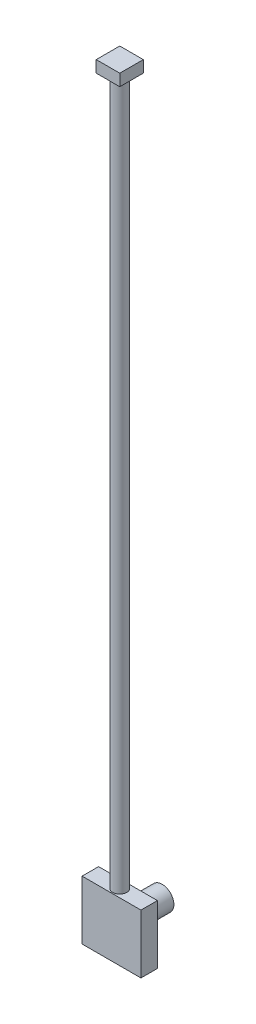
ISO-10303-21;
HEADER;
FILE_DESCRIPTION(('STEP AP214'),'2;1');
FILE_NAME('part.step','',(''),(''),'','','');
FILE_SCHEMA(('AUTOMOTIVE_DESIGN { 1 0 10303 214 1 1 1 1 }'));
ENDSEC;
DATA;
#1=APPLICATION_CONTEXT('core data for automotive mechanical design processes');
#2=APPLICATION_PROTOCOL_DEFINITION('international standard','automotive_design',2000,#1);
#3=PRODUCT_CONTEXT('',#1,'mechanical');
#4=PRODUCT('Part','Part','',(#3));
#5=PRODUCT_RELATED_PRODUCT_CATEGORY('part','',(#4));
#6=PRODUCT_DEFINITION_FORMATION('','',#4);
#7=PRODUCT_DEFINITION_CONTEXT('part definition',#1,'design');
#8=PRODUCT_DEFINITION('design','',#6,#7);
#9=PRODUCT_DEFINITION_SHAPE('','',#8);
#10=(LENGTH_UNIT() NAMED_UNIT(*) SI_UNIT(.MILLI.,.METRE.));
#11=(NAMED_UNIT(*) PLANE_ANGLE_UNIT() SI_UNIT($,.RADIAN.));
#12=(NAMED_UNIT(*) SI_UNIT($,.STERADIAN.) SOLID_ANGLE_UNIT());
#13=UNCERTAINTY_MEASURE_WITH_UNIT(LENGTH_MEASURE(1.E-05),#10,'distance_accuracy_value','');
#14=(GEOMETRIC_REPRESENTATION_CONTEXT(3) GLOBAL_UNCERTAINTY_ASSIGNED_CONTEXT((#13)) GLOBAL_UNIT_ASSIGNED_CONTEXT((#10,
#11,#12)) REPRESENTATION_CONTEXT('',''));
#15=CARTESIAN_POINT('',(0.,0.,0.));
#16=DIRECTION('',(0.,0.,1.));
#17=DIRECTION('',(1.,0.,0.));
#18=AXIS2_PLACEMENT_3D('',#15,#16,#17);
#19=CARTESIAN_POINT('',(125.,-125.,35.));
#20=DIRECTION('',(-1.,0.,0.));
#21=DIRECTION('',(0.,0.,1.));
#22=AXIS2_PLACEMENT_3D('',#19,#20,#21);
#23=PLANE('',#22);
#24=DIRECTION('',(0.,1.,0.));
#25=VECTOR('',#24,1.);
#26=CARTESIAN_POINT('',(125.,-125.,-35.));
#27=LINE('',#26,#25);
#28=CARTESIAN_POINT('',(125.,-125.,-35.));
#29=VERTEX_POINT('',#28);
#30=CARTESIAN_POINT('',(125.,125.,-35.));
#31=VERTEX_POINT('',#30);
#32=EDGE_CURVE('E146',#29,#31,#27,.T.);
#33=ORIENTED_EDGE('',*,*,#32,.T.);
#34=DIRECTION('',(0.,0.,-1.));
#35=VECTOR('',#34,1.);
#36=CARTESIAN_POINT('',(125.,125.,35.));
#37=LINE('',#36,#35);
#38=CARTESIAN_POINT('',(125.,125.,35.));
#39=VERTEX_POINT('',#38);
#40=EDGE_CURVE('E11',#39,#31,#37,.T.);
#41=ORIENTED_EDGE('',*,*,#40,.F.);
#42=DIRECTION('',(0.,1.,0.));
#43=VECTOR('',#42,1.);
#44=CARTESIAN_POINT('',(125.,-125.,35.));
#45=LINE('',#44,#43);
#46=CARTESIAN_POINT('',(125.,-125.,35.));
#47=VERTEX_POINT('',#46);
#48=EDGE_CURVE('E147',#47,#39,#45,.T.);
#49=ORIENTED_EDGE('',*,*,#48,.F.);
#50=DIRECTION('',(0.,0.,-1.));
#51=VECTOR('',#50,1.);
#52=CARTESIAN_POINT('',(125.,-125.,35.));
#53=LINE('',#52,#51);
#54=EDGE_CURVE('E153',#47,#29,#53,.T.);
#55=ORIENTED_EDGE('',*,*,#54,.T.);
#56=EDGE_LOOP('',(#33,#41,#49,#55));
#57=FACE_BOUND('',#56,.T.);
#58=ADVANCED_FACE('F35',(#57),#23,.F.);
#59=CARTESIAN_POINT('',(125.,125.,35.));
#60=DIRECTION('',(0.,-1.,0.));
#61=DIRECTION('',(1.,0.,0.));
#62=AXIS2_PLACEMENT_3D('',#59,#60,#61);
#63=PLANE('',#62);
#64=CARTESIAN_POINT('',(0.,125.,0.));
#65=DIRECTION('',(0.,-1.,0.));
#66=DIRECTION('',(1.,0.,0.));
#67=AXIS2_PLACEMENT_3D('',#64,#65,#66);
#68=CIRCLE('',#67,30.);
#69=CARTESIAN_POINT('',(30.,125.,0.));
#70=VERTEX_POINT('',#69);
#71=EDGE_CURVE('E138',#70,#70,#68,.T.);
#72=ORIENTED_EDGE('',*,*,#71,.T.);
#73=EDGE_LOOP('',(#72));
#74=FACE_BOUND('',#73,.T.);
#75=DIRECTION('',(-1.,0.,0.));
#76=VECTOR('',#75,1.);
#77=CARTESIAN_POINT('',(125.,125.,-35.));
#78=LINE('',#77,#76);
#79=CARTESIAN_POINT('',(-125.,125.,-35.));
#80=VERTEX_POINT('',#79);
#81=EDGE_CURVE('E156',#31,#80,#78,.T.);
#82=ORIENTED_EDGE('',*,*,#81,.T.);
#83=DIRECTION('',(0.,0.,-1.));
#84=VECTOR('',#83,1.);
#85=CARTESIAN_POINT('',(-125.,125.,35.));
#86=LINE('',#85,#84);
#87=CARTESIAN_POINT('',(-125.,125.,35.));
#88=VERTEX_POINT('',#87);
#89=EDGE_CURVE('E44',#88,#80,#86,.T.);
#90=ORIENTED_EDGE('',*,*,#89,.F.);
#91=DIRECTION('',(-1.,0.,0.));
#92=VECTOR('',#91,1.);
#93=CARTESIAN_POINT('',(125.,125.,35.));
#94=LINE('',#93,#92);
#95=EDGE_CURVE('E83',#39,#88,#94,.T.);
#96=ORIENTED_EDGE('',*,*,#95,.F.);
#97=ORIENTED_EDGE('',*,*,#40,.T.);
#98=EDGE_LOOP('',(#82,#90,#96,#97));
#99=FACE_BOUND('',#98,.T.);
#100=ADVANCED_FACE('F180',(#74,#99),#63,.F.);
#101=CARTESIAN_POINT('',(-125.,125.,35.));
#102=DIRECTION('',(1.,0.,0.));
#103=DIRECTION('',(0.,1.,0.));
#104=AXIS2_PLACEMENT_3D('',#101,#102,#103);
#105=PLANE('',#104);
#106=DIRECTION('',(0.,-1.,0.));
#107=VECTOR('',#106,1.);
#108=CARTESIAN_POINT('',(-125.,125.,-35.));
#109=LINE('',#108,#107);
#110=CARTESIAN_POINT('',(-125.,-125.,-35.));
#111=VERTEX_POINT('',#110);
#112=EDGE_CURVE('E70',#80,#111,#109,.T.);
#113=ORIENTED_EDGE('',*,*,#112,.T.);
#114=DIRECTION('',(0.,0.,-1.));
#115=VECTOR('',#114,1.);
#116=CARTESIAN_POINT('',(-125.,-125.,35.));
#117=LINE('',#116,#115);
#118=CARTESIAN_POINT('',(-125.,-125.,35.));
#119=VERTEX_POINT('',#118);
#120=EDGE_CURVE('E161',#119,#111,#117,.T.);
#121=ORIENTED_EDGE('',*,*,#120,.F.);
#122=DIRECTION('',(0.,-1.,0.));
#123=VECTOR('',#122,1.);
#124=CARTESIAN_POINT('',(-125.,125.,35.));
#125=LINE('',#124,#123);
#126=EDGE_CURVE('E150',#88,#119,#125,.T.);
#127=ORIENTED_EDGE('',*,*,#126,.F.);
#128=ORIENTED_EDGE('',*,*,#89,.T.);
#129=EDGE_LOOP('',(#113,#121,#127,#128));
#130=FACE_BOUND('',#129,.T.);
#131=ADVANCED_FACE('F164',(#130),#105,.F.);
#132=CARTESIAN_POINT('',(-125.,-125.,35.));
#133=DIRECTION('',(0.,1.,0.));
#134=DIRECTION('',(0.,0.,1.));
#135=AXIS2_PLACEMENT_3D('',#132,#133,#134);
#136=PLANE('',#135);
#137=DIRECTION('',(1.,0.,0.));
#138=VECTOR('',#137,1.);
#139=CARTESIAN_POINT('',(-125.,-125.,-35.));
#140=LINE('',#139,#138);
#141=EDGE_CURVE('E76',#111,#29,#140,.T.);
#142=ORIENTED_EDGE('',*,*,#141,.T.);
#143=ORIENTED_EDGE('',*,*,#54,.F.);
#144=DIRECTION('',(1.,0.,0.));
#145=VECTOR('',#144,1.);
#146=CARTESIAN_POINT('',(-125.,-125.,35.));
#147=LINE('',#146,#145);
#148=EDGE_CURVE('E52',#119,#47,#147,.T.);
#149=ORIENTED_EDGE('',*,*,#148,.F.);
#150=ORIENTED_EDGE('',*,*,#120,.T.);
#151=EDGE_LOOP('',(#142,#143,#149,#150));
#152=FACE_BOUND('',#151,.T.);
#153=ADVANCED_FACE('F171',(#152),#136,.F.);
#154=CARTESIAN_POINT('',(0.,0.,35.));
#155=DIRECTION('',(0.,0.,1.));
#156=DIRECTION('',(1.,0.,0.));
#157=AXIS2_PLACEMENT_3D('',#154,#155,#156);
#158=PLANE('',#157);
#159=ORIENTED_EDGE('',*,*,#48,.T.);
#160=ORIENTED_EDGE('',*,*,#95,.T.);
#161=ORIENTED_EDGE('',*,*,#126,.T.);
#162=ORIENTED_EDGE('',*,*,#148,.T.);
#163=EDGE_LOOP('',(#159,#160,#161,#162));
#164=FACE_BOUND('',#163,.T.);
#165=ADVANCED_FACE('F173',(#164),#158,.T.);
#166=CARTESIAN_POINT('',(0.,0.,-35.));
#167=DIRECTION('',(0.,0.,1.));
#168=DIRECTION('',(1.,0.,0.));
#169=AXIS2_PLACEMENT_3D('',#166,#167,#168);
#170=PLANE('',#169);
#171=CARTESIAN_POINT('',(0.,0.,-35.));
#172=DIRECTION('',(0.,0.,1.));
#173=DIRECTION('',(1.,0.,0.));
#174=AXIS2_PLACEMENT_3D('',#171,#172,#173);
#175=CIRCLE('',#174,50.);
#176=CARTESIAN_POINT('',(50.,0.,-35.));
#177=VERTEX_POINT('',#176);
#178=EDGE_CURVE('E38',#177,#177,#175,.T.);
#179=ORIENTED_EDGE('',*,*,#178,.T.);
#180=EDGE_LOOP('',(#179));
#181=FACE_BOUND('',#180,.T.);
#182=ORIENTED_EDGE('',*,*,#32,.F.);
#183=ORIENTED_EDGE('',*,*,#141,.F.);
#184=ORIENTED_EDGE('',*,*,#112,.F.);
#185=ORIENTED_EDGE('',*,*,#81,.F.);
#186=EDGE_LOOP('',(#182,#183,#184,#185));
#187=FACE_BOUND('',#186,.T.);
#188=ADVANCED_FACE('F167',(#181,#187),#170,.F.);
#189=CARTESIAN_POINT('',(0.,3125.,0.));
#190=DIRECTION('',(0.,-1.,0.));
#191=DIRECTION('',(0.,0.,-1.));
#192=AXIS2_PLACEMENT_3D('',#189,#190,#191);
#193=CYLINDRICAL_SURFACE('',#192,30.);
#194=CARTESIAN_POINT('',(0.,3125.,0.));
#195=DIRECTION('',(0.,1.,0.));
#196=DIRECTION('',(0.,0.,1.));
#197=AXIS2_PLACEMENT_3D('',#194,#195,#196);
#198=CIRCLE('',#197,30.);
#199=CARTESIAN_POINT('',(0.,3125.,30.));
#200=VERTEX_POINT('',#199);
#201=EDGE_CURVE('E135',#200,#200,#198,.F.);
#202=ORIENTED_EDGE('',*,*,#201,.T.);
#203=EDGE_LOOP('',(#202));
#204=FACE_BOUND('',#203,.T.);
#205=ORIENTED_EDGE('',*,*,#71,.F.);
#206=EDGE_LOOP('',(#205));
#207=FACE_BOUND('',#206,.T.);
#208=ADVANCED_FACE('F192',(#204,#207),#193,.T.);
#209=CARTESIAN_POINT('',(49.9999999999994,3175.,50.));
#210=DIRECTION('',(-1.,0.,0.));
#211=DIRECTION('',(0.,0.,1.));
#212=AXIS2_PLACEMENT_3D('',#209,#210,#211);
#213=PLANE('',#212);
#214=DIRECTION('',(0.,0.,-1.));
#215=VECTOR('',#214,1.);
#216=CARTESIAN_POINT('',(49.9999999999994,3125.,50.));
#217=LINE('',#216,#215);
#218=CARTESIAN_POINT('',(49.9999999999994,3125.,50.));
#219=VERTEX_POINT('',#218);
#220=CARTESIAN_POINT('',(49.9999999999994,3125.,-50.));
#221=VERTEX_POINT('',#220);
#222=EDGE_CURVE('E134',#219,#221,#217,.T.);
#223=ORIENTED_EDGE('',*,*,#222,.T.);
#224=DIRECTION('',(0.,-1.,0.));
#225=VECTOR('',#224,1.);
#226=CARTESIAN_POINT('',(49.9999999999994,3175.,-50.));
#227=LINE('',#226,#225);
#228=CARTESIAN_POINT('',(49.9999999999994,3175.,-50.));
#229=VERTEX_POINT('',#228);
#230=EDGE_CURVE('E114',#229,#221,#227,.T.);
#231=ORIENTED_EDGE('',*,*,#230,.F.);
#232=DIRECTION('',(0.,0.,-1.));
#233=VECTOR('',#232,1.);
#234=CARTESIAN_POINT('',(49.9999999999994,3175.,50.));
#235=LINE('',#234,#233);
#236=CARTESIAN_POINT('',(49.9999999999994,3175.,50.));
#237=VERTEX_POINT('',#236);
#238=EDGE_CURVE('E121',#237,#229,#235,.T.);
#239=ORIENTED_EDGE('',*,*,#238,.F.);
#240=DIRECTION('',(0.,-1.,0.));
#241=VECTOR('',#240,1.);
#242=CARTESIAN_POINT('',(49.9999999999994,3175.,50.));
#243=LINE('',#242,#241);
#244=EDGE_CURVE('E236',#237,#219,#243,.T.);
#245=ORIENTED_EDGE('',*,*,#244,.T.);
#246=EDGE_LOOP('',(#223,#231,#239,#245));
#247=FACE_BOUND('',#246,.T.);
#248=ADVANCED_FACE('F132',(#247),#213,.F.);
#249=CARTESIAN_POINT('',(49.9999999999994,3175.,-50.));
#250=DIRECTION('',(0.,0.,1.));
#251=DIRECTION('',(1.,0.,0.));
#252=AXIS2_PLACEMENT_3D('',#249,#250,#251);
#253=PLANE('',#252);
#254=DIRECTION('',(-1.,0.,0.));
#255=VECTOR('',#254,1.);
#256=CARTESIAN_POINT('',(49.9999999999994,3125.,-50.));
#257=LINE('',#256,#255);
#258=CARTESIAN_POINT('',(-50.0000000000006,3125.,-50.));
#259=VERTEX_POINT('',#258);
#260=EDGE_CURVE('E238',#221,#259,#257,.T.);
#261=ORIENTED_EDGE('',*,*,#260,.T.);
#262=DIRECTION('',(0.,-1.,0.));
#263=VECTOR('',#262,1.);
#264=CARTESIAN_POINT('',(-50.0000000000006,3175.,-50.));
#265=LINE('',#264,#263);
#266=CARTESIAN_POINT('',(-50.0000000000006,3175.,-50.));
#267=VERTEX_POINT('',#266);
#268=EDGE_CURVE('E117',#267,#259,#265,.T.);
#269=ORIENTED_EDGE('',*,*,#268,.F.);
#270=DIRECTION('',(-1.,0.,0.));
#271=VECTOR('',#270,1.);
#272=CARTESIAN_POINT('',(49.9999999999994,3175.,-50.));
#273=LINE('',#272,#271);
#274=EDGE_CURVE('E110',#229,#267,#273,.T.);
#275=ORIENTED_EDGE('',*,*,#274,.F.);
#276=ORIENTED_EDGE('',*,*,#230,.T.);
#277=EDGE_LOOP('',(#261,#269,#275,#276));
#278=FACE_BOUND('',#277,.T.);
#279=ADVANCED_FACE('F112',(#278),#253,.F.);
#280=CARTESIAN_POINT('',(-50.0000000000006,3175.,-50.));
#281=DIRECTION('',(1.,0.,0.));
#282=DIRECTION('',(0.,1.,0.));
#283=AXIS2_PLACEMENT_3D('',#280,#281,#282);
#284=PLANE('',#283);
#285=DIRECTION('',(0.,0.,1.));
#286=VECTOR('',#285,1.);
#287=CARTESIAN_POINT('',(-50.0000000000006,3125.,-50.));
#288=LINE('',#287,#286);
#289=CARTESIAN_POINT('',(-50.0000000000006,3125.,50.));
#290=VERTEX_POINT('',#289);
#291=EDGE_CURVE('E240',#259,#290,#288,.T.);
#292=ORIENTED_EDGE('',*,*,#291,.T.);
#293=DIRECTION('',(0.,-1.,0.));
#294=VECTOR('',#293,1.);
#295=CARTESIAN_POINT('',(-50.0000000000006,3175.,50.));
#296=LINE('',#295,#294);
#297=CARTESIAN_POINT('',(-50.0000000000006,3175.,50.));
#298=VERTEX_POINT('',#297);
#299=EDGE_CURVE('E140',#298,#290,#296,.T.);
#300=ORIENTED_EDGE('',*,*,#299,.F.);
#301=DIRECTION('',(0.,0.,1.));
#302=VECTOR('',#301,1.);
#303=CARTESIAN_POINT('',(-50.0000000000006,3175.,-50.));
#304=LINE('',#303,#302);
#305=EDGE_CURVE('E120',#267,#298,#304,.T.);
#306=ORIENTED_EDGE('',*,*,#305,.F.);
#307=ORIENTED_EDGE('',*,*,#268,.T.);
#308=EDGE_LOOP('',(#292,#300,#306,#307));
#309=FACE_BOUND('',#308,.T.);
#310=ADVANCED_FACE('F205',(#309),#284,.F.);
#311=CARTESIAN_POINT('',(-50.0000000000006,3175.,50.));
#312=DIRECTION('',(0.,0.,-1.));
#313=DIRECTION('',(-1.,0.,0.));
#314=AXIS2_PLACEMENT_3D('',#311,#312,#313);
#315=PLANE('',#314);
#316=DIRECTION('',(1.,0.,0.));
#317=VECTOR('',#316,1.);
#318=CARTESIAN_POINT('',(-50.0000000000006,3125.,50.));
#319=LINE('',#318,#317);
#320=EDGE_CURVE('E130',#290,#219,#319,.T.);
#321=ORIENTED_EDGE('',*,*,#320,.T.);
#322=ORIENTED_EDGE('',*,*,#244,.F.);
#323=DIRECTION('',(1.,0.,0.));
#324=VECTOR('',#323,1.);
#325=CARTESIAN_POINT('',(-50.0000000000006,3175.,50.));
#326=LINE('',#325,#324);
#327=EDGE_CURVE('E126',#298,#237,#326,.T.);
#328=ORIENTED_EDGE('',*,*,#327,.F.);
#329=ORIENTED_EDGE('',*,*,#299,.T.);
#330=EDGE_LOOP('',(#321,#322,#328,#329));
#331=FACE_BOUND('',#330,.T.);
#332=ADVANCED_FACE('F208',(#331),#315,.F.);
#333=CARTESIAN_POINT('',(0.,3175.,0.));
#334=DIRECTION('',(0.,1.,0.));
#335=DIRECTION('',(0.,0.,1.));
#336=AXIS2_PLACEMENT_3D('',#333,#334,#335);
#337=PLANE('',#336);
#338=ORIENTED_EDGE('',*,*,#238,.T.);
#339=ORIENTED_EDGE('',*,*,#274,.T.);
#340=ORIENTED_EDGE('',*,*,#305,.T.);
#341=ORIENTED_EDGE('',*,*,#327,.T.);
#342=EDGE_LOOP('',(#338,#339,#340,#341));
#343=FACE_BOUND('',#342,.T.);
#344=ADVANCED_FACE('F124',(#343),#337,.T.);
#345=CARTESIAN_POINT('',(0.,3125.,0.));
#346=DIRECTION('',(0.,1.,0.));
#347=DIRECTION('',(0.,0.,1.));
#348=AXIS2_PLACEMENT_3D('',#345,#346,#347);
#349=PLANE('',#348);
#350=ORIENTED_EDGE('',*,*,#201,.F.);
#351=EDGE_LOOP('',(#350));
#352=FACE_BOUND('',#351,.T.);
#353=ORIENTED_EDGE('',*,*,#222,.F.);
#354=ORIENTED_EDGE('',*,*,#320,.F.);
#355=ORIENTED_EDGE('',*,*,#291,.F.);
#356=ORIENTED_EDGE('',*,*,#260,.F.);
#357=EDGE_LOOP('',(#353,#354,#355,#356));
#358=FACE_BOUND('',#357,.T.);
#359=ADVANCED_FACE('F213',(#352,#358),#349,.F.);
#360=CARTESIAN_POINT('',(0.,0.,-180.));
#361=DIRECTION('',(0.,0.,1.));
#362=DIRECTION('',(1.,0.,0.));
#363=AXIS2_PLACEMENT_3D('',#360,#361,#362);
#364=CYLINDRICAL_SURFACE('',#363,50.);
#365=CARTESIAN_POINT('',(0.,0.,-180.));
#366=DIRECTION('',(0.,0.,1.));
#367=DIRECTION('',(1.,0.,0.));
#368=AXIS2_PLACEMENT_3D('',#365,#366,#367);
#369=CIRCLE('',#368,50.);
#370=CARTESIAN_POINT('',(50.,0.,-180.));
#371=VERTEX_POINT('',#370);
#372=EDGE_CURVE('E230',#371,#371,#369,.T.);
#373=CARTESIAN_POINT('',(50.,0.,-180.));
#374=CARTESIAN_POINT('',(50.,0.,-178.489583333333));
#375=CARTESIAN_POINT('',(50.,0.,-176.979166666667));
#376=CARTESIAN_POINT('',(50.,0.,-173.958333333333));
#377=CARTESIAN_POINT('',(50.,0.,-172.447916666667));
#378=CARTESIAN_POINT('',(50.,0.,-169.427083333333));
#379=CARTESIAN_POINT('',(50.,0.,-167.916666666667));
#380=CARTESIAN_POINT('',(50.,0.,-164.895833333333));
#381=CARTESIAN_POINT('',(50.,0.,-163.385416666667));
#382=CARTESIAN_POINT('',(50.,0.,-160.364583333333));
#383=CARTESIAN_POINT('',(50.,0.,-158.854166666667));
#384=CARTESIAN_POINT('',(50.,0.,-155.833333333333));
#385=CARTESIAN_POINT('',(50.,0.,-154.322916666667));
#386=CARTESIAN_POINT('',(50.,0.,-151.302083333333));
#387=CARTESIAN_POINT('',(50.,0.,-149.791666666667));
#388=CARTESIAN_POINT('',(50.,0.,-146.770833333333));
#389=CARTESIAN_POINT('',(50.,0.,-145.260416666667));
#390=CARTESIAN_POINT('',(50.,0.,-142.239583333333));
#391=CARTESIAN_POINT('',(50.,0.,-140.729166666667));
#392=CARTESIAN_POINT('',(50.,0.,-137.708333333333));
#393=CARTESIAN_POINT('',(50.,0.,-136.197916666667));
#394=CARTESIAN_POINT('',(50.,0.,-133.177083333333));
#395=CARTESIAN_POINT('',(50.,0.,-131.666666666667));
#396=CARTESIAN_POINT('',(50.,0.,-128.645833333333));
#397=CARTESIAN_POINT('',(50.,0.,-127.135416666667));
#398=CARTESIAN_POINT('',(50.,0.,-124.114583333333));
#399=CARTESIAN_POINT('',(50.,0.,-122.604166666667));
#400=CARTESIAN_POINT('',(50.,0.,-119.583333333333));
#401=CARTESIAN_POINT('',(50.,0.,-118.072916666667));
#402=CARTESIAN_POINT('',(50.,0.,-115.052083333333));
#403=CARTESIAN_POINT('',(50.,0.,-113.541666666667));
#404=CARTESIAN_POINT('',(50.,0.,-110.520833333333));
#405=CARTESIAN_POINT('',(50.,0.,-109.010416666667));
#406=CARTESIAN_POINT('',(50.,0.,-105.989583333333));
#407=CARTESIAN_POINT('',(50.,0.,-104.479166666667));
#408=CARTESIAN_POINT('',(50.,0.,-101.458333333333));
#409=CARTESIAN_POINT('',(50.,0.,-99.9479166666667));
#410=CARTESIAN_POINT('',(50.,0.,-96.9270833333334));
#411=CARTESIAN_POINT('',(50.,0.,-95.4166666666667));
#412=CARTESIAN_POINT('',(50.,0.,-92.3958333333334));
#413=CARTESIAN_POINT('',(50.,0.,-90.8854166666667));
#414=CARTESIAN_POINT('',(50.,0.,-87.8645833333334));
#415=CARTESIAN_POINT('',(50.,0.,-86.3541666666667));
#416=CARTESIAN_POINT('',(50.,0.,-83.3333333333334));
#417=CARTESIAN_POINT('',(50.,0.,-81.8229166666667));
#418=CARTESIAN_POINT('',(50.,0.,-78.8020833333334));
#419=CARTESIAN_POINT('',(50.,0.,-77.2916666666667));
#420=CARTESIAN_POINT('',(50.,0.,-74.2708333333334));
#421=CARTESIAN_POINT('',(50.,0.,-72.7604166666667));
#422=CARTESIAN_POINT('',(50.,0.,-69.7395833333333));
#423=CARTESIAN_POINT('',(50.,0.,-68.2291666666667));
#424=CARTESIAN_POINT('',(50.,0.,-65.2083333333333));
#425=CARTESIAN_POINT('',(50.,0.,-63.6979166666667));
#426=CARTESIAN_POINT('',(50.,0.,-60.6770833333333));
#427=CARTESIAN_POINT('',(50.,0.,-59.1666666666667));
#428=CARTESIAN_POINT('',(50.,0.,-56.1458333333333));
#429=CARTESIAN_POINT('',(50.,0.,-54.6354166666667));
#430=CARTESIAN_POINT('',(50.,0.,-51.6145833333334));
#431=CARTESIAN_POINT('',(50.,0.,-50.1041666666667));
#432=CARTESIAN_POINT('',(50.,0.,-47.0833333333334));
#433=CARTESIAN_POINT('',(50.,0.,-45.5729166666667));
#434=CARTESIAN_POINT('',(50.,0.,-42.5520833333334));
#435=CARTESIAN_POINT('',(50.,0.,-41.0416666666667));
#436=CARTESIAN_POINT('',(50.,0.,-38.0208333333334));
#437=CARTESIAN_POINT('',(50.,0.,-36.5104166666667));
#438=CARTESIAN_POINT('',(50.,0.,-35.));
#439=B_SPLINE_CURVE_WITH_KNOTS('',3,(#373,#374,#375,#376,#377,#378,#379,#380,#381,#382,#383,
#384,#385,#386,#387,#388,#389,#390,#391,#392,#393,#394,#395,#396,#397,#398,#399,#400,#401,#402,
#403,#404,#405,#406,#407,#408,#409,#410,#411,#412,#413,#414,#415,#416,#417,#418,#419,#420,#421,
#422,#423,#424,#425,#426,#427,#428,#429,#430,#431,#432,#433,#434,#435,#436,#437,#438),
.UNSPECIFIED.,.F.,.F.,(4,2,2,2,2,2,2,2,2,2,2,2,2,2,2,2,2,2,2,2,2,2,2,2,2,2,2,2,2,2,2,2,4),(0.,
4.53125000000001,9.06250000000003,13.59375,18.125,22.65625,27.1875,31.71875,36.25,40.78125,
45.3125,49.84375,54.375,58.90625,63.4375,67.96875,72.5,77.03125,81.5625,86.09375,90.625,
95.15625,99.6875,104.21875,108.75,113.28125,117.8125,122.34375,126.875,131.40625,135.9375,
140.46875,145.),.UNSPECIFIED.);
#440=EDGE_CURVE('BSEAM216',#371,#177,#439,.T.);
#441=ORIENTED_EDGE('',*,*,#372,.T.);
#442=ORIENTED_EDGE('',*,*,#178,.F.);
#443=ORIENTED_EDGE('',*,*,#440,.T.);
#444=ORIENTED_EDGE('',*,*,#440,.F.);
#445=EDGE_LOOP('',(#441,#443,#442,#444));
#446=FACE_BOUND('',#445,.T.);
#447=ADVANCED_FACE('F216',(#446),#364,.T.);
#448=CARTESIAN_POINT('',(0.,0.,-180.));
#449=DIRECTION('',(0.,0.,1.));
#450=DIRECTION('',(1.,0.,0.));
#451=AXIS2_PLACEMENT_3D('',#448,#449,#450);
#452=PLANE('',#451);
#453=ORIENTED_EDGE('',*,*,#372,.F.);
#454=EDGE_LOOP('',(#453));
#455=FACE_BOUND('',#454,.T.);
#456=ADVANCED_FACE('F222',(#455),#452,.F.);
#457=CLOSED_SHELL('',(#58,#100,#131,#153,#165,#188,#208,#248,#279,#310,#332,#344,#359,#447,#456));
#458=MANIFOLD_SOLID_BREP('B2',#457);
#459=ADVANCED_BREP_SHAPE_REPRESENTATION('',(#18,#458),#14);
#460=SHAPE_DEFINITION_REPRESENTATION(#9,#459);
ENDSEC;
END-ISO-10303-21;
